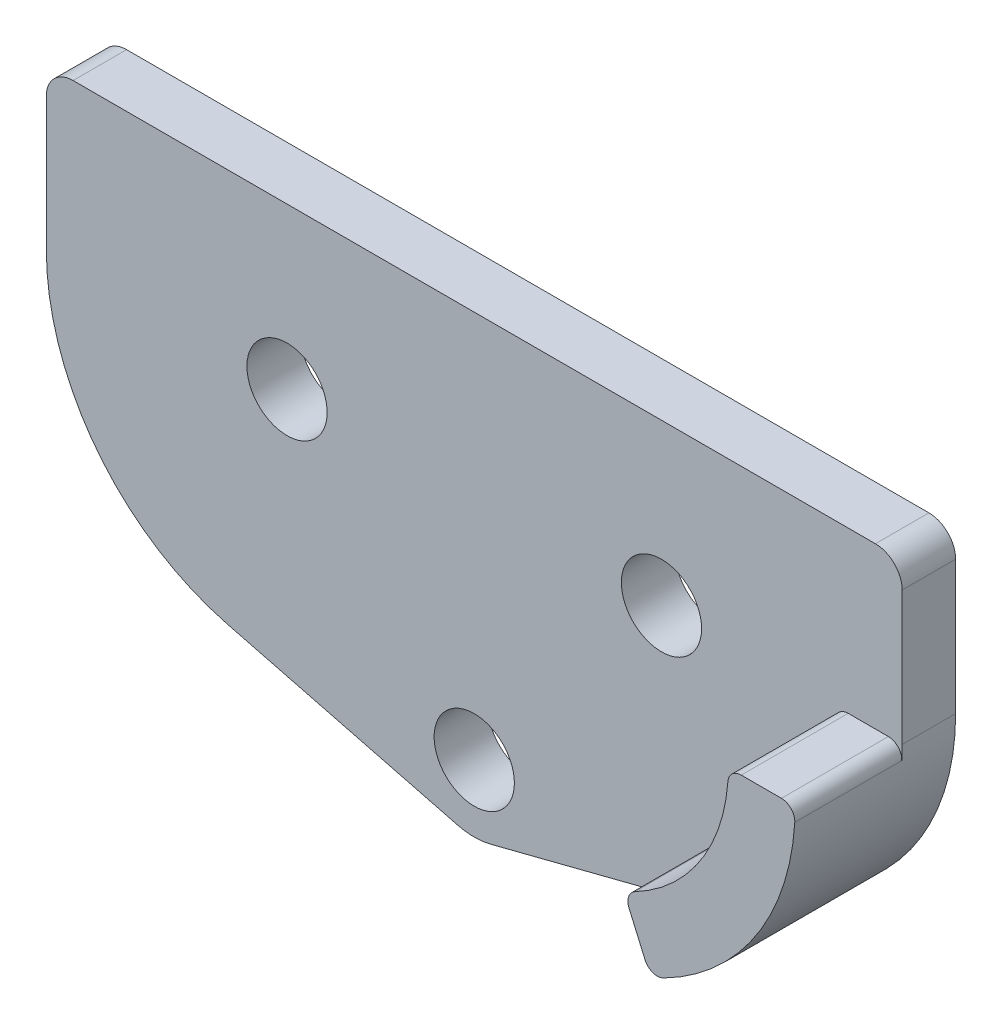
ISO-10303-21;
HEADER;
FILE_DESCRIPTION(('STEP AP214'),'2;1');
FILE_NAME('part.step','',(''),(''),'','','');
FILE_SCHEMA(('AUTOMOTIVE_DESIGN { 1 0 10303 214 1 1 1 1 }'));
ENDSEC;
DATA;
#1=APPLICATION_CONTEXT('core data for automotive mechanical design processes');
#2=APPLICATION_PROTOCOL_DEFINITION('international standard','automotive_design',2000,#1);
#3=PRODUCT_CONTEXT('',#1,'mechanical');
#4=PRODUCT('Part','Part','',(#3));
#5=PRODUCT_RELATED_PRODUCT_CATEGORY('part','',(#4));
#6=PRODUCT_DEFINITION_FORMATION('','',#4);
#7=PRODUCT_DEFINITION_CONTEXT('part definition',#1,'design');
#8=PRODUCT_DEFINITION('design','',#6,#7);
#9=PRODUCT_DEFINITION_SHAPE('','',#8);
#10=(LENGTH_UNIT() NAMED_UNIT(*) SI_UNIT(.MILLI.,.METRE.));
#11=(NAMED_UNIT(*) PLANE_ANGLE_UNIT() SI_UNIT($,.RADIAN.));
#12=(NAMED_UNIT(*) SI_UNIT($,.STERADIAN.) SOLID_ANGLE_UNIT());
#13=UNCERTAINTY_MEASURE_WITH_UNIT(LENGTH_MEASURE(1.E-05),#10,'distance_accuracy_value','');
#14=(GEOMETRIC_REPRESENTATION_CONTEXT(3) GLOBAL_UNCERTAINTY_ASSIGNED_CONTEXT((#13)) GLOBAL_UNIT_ASSIGNED_CONTEXT((#10,
#11,#12)) REPRESENTATION_CONTEXT('',''));
#15=CARTESIAN_POINT('',(0.,0.,0.));
#16=DIRECTION('',(0.,0.,1.));
#17=DIRECTION('',(1.,0.,0.));
#18=AXIS2_PLACEMENT_3D('',#15,#16,#17);
#19=CARTESIAN_POINT('',(7.,0.,2.));
#20=DIRECTION('',(0.,0.,1.));
#21=DIRECTION('',(1.,0.,0.));
#22=AXIS2_PLACEMENT_3D('',#19,#20,#21);
#23=PLANE('',#22);
#24=DIRECTION('',(-1.,0.,0.));
#25=VECTOR('',#24,1.);
#26=CARTESIAN_POINT('',(16.,6.,2.));
#27=LINE('',#26,#25);
#28=CARTESIAN_POINT('',(15.,6.,2.));
#29=VERTEX_POINT('',#28);
#30=CARTESIAN_POINT('',(-15.,6.,2.));
#31=VERTEX_POINT('',#30);
#32=EDGE_CURVE('E167',#29,#31,#27,.T.);
#33=ORIENTED_EDGE('',*,*,#32,.T.);
#34=CARTESIAN_POINT('',(-15.,5.,2.));
#35=DIRECTION('',(0.,0.,1.));
#36=DIRECTION('',(1.,0.,0.));
#37=AXIS2_PLACEMENT_3D('',#34,#35,#36);
#38=CIRCLE('',#37,1.);
#39=CARTESIAN_POINT('',(-16.,5.,2.));
#40=VERTEX_POINT('',#39);
#41=EDGE_CURVE('E163',#31,#40,#38,.T.);
#42=ORIENTED_EDGE('',*,*,#41,.T.);
#43=DIRECTION('',(0.,-1.,0.));
#44=VECTOR('',#43,1.);
#45=CARTESIAN_POINT('',(-16.,0.,2.));
#46=LINE('',#45,#44);
#47=CARTESIAN_POINT('',(-16.,0.,2.));
#48=VERTEX_POINT('',#47);
#49=EDGE_CURVE('E155',#40,#48,#46,.T.);
#50=ORIENTED_EDGE('',*,*,#49,.T.);
#51=CARTESIAN_POINT('',(-7.,0.,2.));
#52=DIRECTION('',(0.,0.,1.));
#53=DIRECTION('',(-1.,0.,0.));
#54=AXIS2_PLACEMENT_3D('',#51,#52,#53);
#55=CIRCLE('',#54,9.00000000000001);
#56=CARTESIAN_POINT('',(-9.2304896736053,-8.7192267900279,2.));
#57=VERTEX_POINT('',#56);
#58=EDGE_CURVE('E160',#48,#57,#55,.T.);
#59=ORIENTED_EDGE('',*,*,#58,.T.);
#60=DIRECTION('',(0.968802976669766,-0.247832185956144,0.));
#61=VECTOR('',#60,1.);
#62=CARTESIAN_POINT('',(-9.2304896736053,-8.7192267900279,2.));
#63=LINE('',#62,#61);
#64=CARTESIAN_POINT('',(-0.619580464890357,-10.9220074416744,2.));
#65=VERTEX_POINT('',#64);
#66=EDGE_CURVE('E182',#57,#65,#63,.T.);
#67=ORIENTED_EDGE('',*,*,#66,.T.);
#68=CARTESIAN_POINT('',(0.,-8.5,2.));
#69=DIRECTION('',(0.,0.,1.));
#70=DIRECTION('',(-1.,0.,0.));
#71=AXIS2_PLACEMENT_3D('',#68,#69,#70);
#72=CIRCLE('',#71,2.5);
#73=CARTESIAN_POINT('',(0.619580464890362,-10.9220074416744,2.));
#74=VERTEX_POINT('',#73);
#75=EDGE_CURVE('E184',#65,#74,#72,.T.);
#76=ORIENTED_EDGE('',*,*,#75,.T.);
#77=DIRECTION('',(0.968802976669766,0.247832185956144,0.));
#78=VECTOR('',#77,1.);
#79=CARTESIAN_POINT('',(9.2304896736053,-8.7192267900279,2.));
#80=LINE('',#79,#78);
#81=CARTESIAN_POINT('',(9.2304896736053,-8.7192267900279,2.));
#82=VERTEX_POINT('',#81);
#83=EDGE_CURVE('E189',#74,#82,#80,.T.);
#84=ORIENTED_EDGE('',*,*,#83,.T.);
#85=CARTESIAN_POINT('',(7.,0.,2.));
#86=DIRECTION('',(0.,0.,1.));
#87=DIRECTION('',(1.,0.,0.));
#88=AXIS2_PLACEMENT_3D('',#85,#86,#87);
#89=CIRCLE('',#88,9.);
#90=CARTESIAN_POINT('',(11.0711124139553,-8.02658356419088,2.));
#91=VERTEX_POINT('',#90);
#92=EDGE_CURVE('E211',#82,#91,#89,.T.);
#93=ORIENTED_EDGE('',*,*,#92,.T.);
#94=CARTESIAN_POINT('',(10.8449395020689,-7.58066225506916,2.));
#95=DIRECTION('',(0.,0.,1.));
#96=DIRECTION('',(1.,0.,0.));
#97=AXIS2_PLACEMENT_3D('',#94,#95,#96);
#98=CIRCLE('',#97,0.5);
#99=CARTESIAN_POINT('',(10.386486062703,-7.78021286001342,2.));
#100=VERTEX_POINT('',#99);
#101=EDGE_CURVE('E270',#91,#100,#98,.F.);
#102=ORIENTED_EDGE('',*,*,#101,.T.);
#103=DIRECTION('',(0.399101209888507,-0.916906878731712,0.));
#104=VECTOR('',#103,1.);
#105=CARTESIAN_POINT('',(9.5941578642753,-5.95989471175613,2.));
#106=LINE('',#105,#104);
#107=CARTESIAN_POINT('',(9.78657254832086,-6.40195387619628,2.));
#108=VERTEX_POINT('',#107);
#109=EDGE_CURVE('E297',#108,#100,#106,.T.);
#110=ORIENTED_EDGE('',*,*,#109,.F.);
#111=CARTESIAN_POINT('',(10.2450259876867,-6.20240327125203,2.));
#112=DIRECTION('',(0.,0.,1.));
#113=DIRECTION('',(1.,0.,0.));
#114=AXIS2_PLACEMENT_3D('',#111,#112,#113);
#115=CIRCLE('',#114,0.5);
#116=CARTESIAN_POINT('',(10.0132384171377,-5.7593744661626,2.));
#117=VERTEX_POINT('',#116);
#118=EDGE_CURVE('E268',#108,#117,#115,.F.);
#119=ORIENTED_EDGE('',*,*,#118,.T.);
#120=CARTESIAN_POINT('',(7.,0.,2.));
#121=DIRECTION('',(0.,0.,-1.));
#122=DIRECTION('',(1.,0.,0.));
#123=AXIS2_PLACEMENT_3D('',#120,#121,#122);
#124=CIRCLE('',#123,6.5);
#125=CARTESIAN_POINT('',(13.4833971631784,-0.464285714285714,2.));
#126=VERTEX_POINT('',#125);
#127=EDGE_CURVE('E304',#126,#117,#124,.T.);
#128=ORIENTED_EDGE('',*,*,#127,.F.);
#129=CARTESIAN_POINT('',(13.9821200218845,-0.5,2.));
#130=DIRECTION('',(0.,0.,1.));
#131=DIRECTION('',(1.,0.,0.));
#132=AXIS2_PLACEMENT_3D('',#129,#130,#131);
#133=CIRCLE('',#132,0.5);
#134=CARTESIAN_POINT('',(13.9821200218845,0.,2.));
#135=VERTEX_POINT('',#134);
#136=EDGE_CURVE('E11',#126,#135,#133,.F.);
#137=ORIENTED_EDGE('',*,*,#136,.T.);
#138=DIRECTION('',(-1.,0.,0.));
#139=VECTOR('',#138,1.);
#140=CARTESIAN_POINT('',(13.5,0.,2.));
#141=LINE('',#140,#139);
#142=CARTESIAN_POINT('',(15.4852813742386,0.,2.));
#143=VERTEX_POINT('',#142);
#144=EDGE_CURVE('E271',#143,#135,#141,.T.);
#145=ORIENTED_EDGE('',*,*,#144,.F.);
#146=CARTESIAN_POINT('',(15.4852813742386,-0.5,2.));
#147=DIRECTION('',(0.,0.,1.));
#148=DIRECTION('',(1.,0.,0.));
#149=AXIS2_PLACEMENT_3D('',#146,#147,#148);
#150=CIRCLE('',#149,0.5);
#151=CARTESIAN_POINT('',(15.9844155727232,-0.529411764705882,2.));
#152=VERTEX_POINT('',#151);
#153=EDGE_CURVE('E41',#143,#152,#150,.F.);
#154=ORIENTED_EDGE('',*,*,#153,.T.);
#155=CARTESIAN_POINT('',(7.,0.,2.));
#156=DIRECTION('',(0.,0.,1.));
#157=DIRECTION('',(1.,0.,0.));
#158=AXIS2_PLACEMENT_3D('',#155,#156,#157);
#159=CIRCLE('',#158,9.);
#160=CARTESIAN_POINT('',(16.,0.,2.));
#161=VERTEX_POINT('',#160);
#162=EDGE_CURVE('E48',#161,#152,#159,.F.);
#163=ORIENTED_EDGE('',*,*,#162,.F.);
#164=DIRECTION('',(0.,1.,0.));
#165=VECTOR('',#164,1.);
#166=CARTESIAN_POINT('',(16.,0.,2.));
#167=LINE('',#166,#165);
#168=CARTESIAN_POINT('',(16.,5.00000000000001,2.));
#169=VERTEX_POINT('',#168);
#170=EDGE_CURVE('E326',#161,#169,#167,.T.);
#171=ORIENTED_EDGE('',*,*,#170,.T.);
#172=CARTESIAN_POINT('',(15.,5.00000000000001,2.));
#173=DIRECTION('',(0.,0.,1.));
#174=DIRECTION('',(1.,0.,0.));
#175=AXIS2_PLACEMENT_3D('',#172,#173,#174);
#176=CIRCLE('',#175,1.);
#177=EDGE_CURVE('E234',#169,#29,#176,.T.);
#178=ORIENTED_EDGE('',*,*,#177,.T.);
#179=EDGE_LOOP('',(#33,#42,#50,#59,#67,#76,#84,#93,#102,#110,#119,#128,#137,#145,#154,#163,#171,#178));
#180=FACE_BOUND('',#179,.T.);
#181=CARTESIAN_POINT('',(7.,0.,2.));
#182=DIRECTION('',(0.,0.,1.));
#183=DIRECTION('',(1.,0.,0.));
#184=AXIS2_PLACEMENT_3D('',#181,#182,#183);
#185=CIRCLE('',#184,1.5);
#186=CARTESIAN_POINT('',(8.5,0.,2.));
#187=VERTEX_POINT('',#186);
#188=EDGE_CURVE('E315',#187,#187,#185,.T.);
#189=ORIENTED_EDGE('',*,*,#188,.F.);
#190=EDGE_LOOP('',(#189));
#191=FACE_BOUND('',#190,.T.);
#192=CARTESIAN_POINT('',(0.,-8.5,2.));
#193=DIRECTION('',(0.,0.,1.));
#194=DIRECTION('',(1.,0.,0.));
#195=AXIS2_PLACEMENT_3D('',#192,#193,#194);
#196=CIRCLE('',#195,1.5);
#197=CARTESIAN_POINT('',(1.5,-8.5,2.));
#198=VERTEX_POINT('',#197);
#199=EDGE_CURVE('E196',#198,#198,#196,.T.);
#200=ORIENTED_EDGE('',*,*,#199,.F.);
#201=EDGE_LOOP('',(#200));
#202=FACE_BOUND('',#201,.T.);
#203=CARTESIAN_POINT('',(-7.,0.,2.));
#204=DIRECTION('',(0.,0.,1.));
#205=DIRECTION('',(-1.,0.,0.));
#206=AXIS2_PLACEMENT_3D('',#203,#204,#205);
#207=CIRCLE('',#206,1.5);
#208=CARTESIAN_POINT('',(-8.5,0.,2.));
#209=VERTEX_POINT('',#208);
#210=EDGE_CURVE('E309',#209,#209,#207,.T.);
#211=ORIENTED_EDGE('',*,*,#210,.F.);
#212=EDGE_LOOP('',(#211));
#213=FACE_BOUND('',#212,.T.);
#214=ADVANCED_FACE('F33',(#180,#191,#202,#213),#23,.T.);
#215=CARTESIAN_POINT('',(7.,0.,0.));
#216=DIRECTION('',(0.,0.,1.));
#217=DIRECTION('',(1.,0.,0.));
#218=AXIS2_PLACEMENT_3D('',#215,#216,#217);
#219=PLANE('',#218);
#220=DIRECTION('',(0.,-1.,0.));
#221=VECTOR('',#220,1.);
#222=CARTESIAN_POINT('',(-16.,0.,0.));
#223=LINE('',#222,#221);
#224=CARTESIAN_POINT('',(-16.,5.,0.));
#225=VERTEX_POINT('',#224);
#226=CARTESIAN_POINT('',(-16.,0.,0.));
#227=VERTEX_POINT('',#226);
#228=EDGE_CURVE('E173',#225,#227,#223,.T.);
#229=ORIENTED_EDGE('',*,*,#228,.F.);
#230=CARTESIAN_POINT('',(-15.,5.,0.));
#231=DIRECTION('',(0.,0.,1.));
#232=DIRECTION('',(1.,0.,0.));
#233=AXIS2_PLACEMENT_3D('',#230,#231,#232);
#234=CIRCLE('',#233,1.);
#235=CARTESIAN_POINT('',(-15.,6.,0.));
#236=VERTEX_POINT('',#235);
#237=EDGE_CURVE('E227',#225,#236,#234,.F.);
#238=ORIENTED_EDGE('',*,*,#237,.T.);
#239=DIRECTION('',(-1.,0.,0.));
#240=VECTOR('',#239,1.);
#241=CARTESIAN_POINT('',(-16.,6.,0.));
#242=LINE('',#241,#240);
#243=CARTESIAN_POINT('',(15.,6.00000000000001,0.));
#244=VERTEX_POINT('',#243);
#245=EDGE_CURVE('E199',#244,#236,#242,.T.);
#246=ORIENTED_EDGE('',*,*,#245,.F.);
#247=CARTESIAN_POINT('',(15.,5.00000000000001,0.));
#248=DIRECTION('',(0.,0.,1.));
#249=DIRECTION('',(1.,0.,0.));
#250=AXIS2_PLACEMENT_3D('',#247,#248,#249);
#251=CIRCLE('',#250,1.);
#252=CARTESIAN_POINT('',(16.,5.00000000000001,0.));
#253=VERTEX_POINT('',#252);
#254=EDGE_CURVE('E225',#244,#253,#251,.F.);
#255=ORIENTED_EDGE('',*,*,#254,.T.);
#256=DIRECTION('',(0.,1.,0.));
#257=VECTOR('',#256,1.);
#258=CARTESIAN_POINT('',(16.,0.,0.));
#259=LINE('',#258,#257);
#260=CARTESIAN_POINT('',(16.,0.,0.));
#261=VERTEX_POINT('',#260);
#262=EDGE_CURVE('E195',#261,#253,#259,.T.);
#263=ORIENTED_EDGE('',*,*,#262,.F.);
#264=CARTESIAN_POINT('',(7.,0.,0.));
#265=DIRECTION('',(0.,0.,1.));
#266=DIRECTION('',(1.,0.,0.));
#267=AXIS2_PLACEMENT_3D('',#264,#265,#266);
#268=CIRCLE('',#267,9.);
#269=CARTESIAN_POINT('',(9.2304896736053,-8.7192267900279,0.));
#270=VERTEX_POINT('',#269);
#271=EDGE_CURVE('E192',#270,#261,#268,.T.);
#272=ORIENTED_EDGE('',*,*,#271,.F.);
#273=DIRECTION('',(0.968802976669766,0.247832185956144,0.));
#274=VECTOR('',#273,1.);
#275=CARTESIAN_POINT('',(9.2304896736053,-8.7192267900279,0.));
#276=LINE('',#275,#274);
#277=CARTESIAN_POINT('',(0.619580464890362,-10.9220074416744,0.));
#278=VERTEX_POINT('',#277);
#279=EDGE_CURVE('E209',#278,#270,#276,.T.);
#280=ORIENTED_EDGE('',*,*,#279,.F.);
#281=CARTESIAN_POINT('',(0.,-8.5,0.));
#282=DIRECTION('',(0.,0.,1.));
#283=DIRECTION('',(-1.,0.,0.));
#284=AXIS2_PLACEMENT_3D('',#281,#282,#283);
#285=CIRCLE('',#284,2.5);
#286=CARTESIAN_POINT('',(-0.619580464890357,-10.9220074416744,0.));
#287=VERTEX_POINT('',#286);
#288=EDGE_CURVE('E207',#287,#278,#285,.T.);
#289=ORIENTED_EDGE('',*,*,#288,.F.);
#290=DIRECTION('',(0.968802976669766,-0.247832185956144,0.));
#291=VECTOR('',#290,1.);
#292=CARTESIAN_POINT('',(-9.2304896736053,-8.7192267900279,0.));
#293=LINE('',#292,#291);
#294=CARTESIAN_POINT('',(-9.2304896736053,-8.7192267900279,0.));
#295=VERTEX_POINT('',#294);
#296=EDGE_CURVE('E205',#295,#287,#293,.T.);
#297=ORIENTED_EDGE('',*,*,#296,.F.);
#298=CARTESIAN_POINT('',(-7.,0.,0.));
#299=DIRECTION('',(0.,0.,1.));
#300=DIRECTION('',(-1.,0.,0.));
#301=AXIS2_PLACEMENT_3D('',#298,#299,#300);
#302=CIRCLE('',#301,9.00000000000001);
#303=EDGE_CURVE('E203',#227,#295,#302,.T.);
#304=ORIENTED_EDGE('',*,*,#303,.F.);
#305=EDGE_LOOP('',(#229,#238,#246,#255,#263,#272,#280,#289,#297,#304));
#306=FACE_BOUND('',#305,.T.);
#307=CARTESIAN_POINT('',(0.,-8.5,0.));
#308=DIRECTION('',(0.,0.,1.));
#309=DIRECTION('',(1.,0.,0.));
#310=AXIS2_PLACEMENT_3D('',#307,#308,#309);
#311=CIRCLE('',#310,1.5);
#312=CARTESIAN_POINT('',(1.5,-8.5,0.));
#313=VERTEX_POINT('',#312);
#314=EDGE_CURVE('E318',#313,#313,#311,.T.);
#315=ORIENTED_EDGE('',*,*,#314,.T.);
#316=EDGE_LOOP('',(#315));
#317=FACE_BOUND('',#316,.T.);
#318=CARTESIAN_POINT('',(7.,0.,0.));
#319=DIRECTION('',(0.,0.,1.));
#320=DIRECTION('',(1.,0.,0.));
#321=AXIS2_PLACEMENT_3D('',#318,#319,#320);
#322=CIRCLE('',#321,1.5);
#323=CARTESIAN_POINT('',(8.5,0.,0.));
#324=VERTEX_POINT('',#323);
#325=EDGE_CURVE('E312',#324,#324,#322,.T.);
#326=ORIENTED_EDGE('',*,*,#325,.T.);
#327=EDGE_LOOP('',(#326));
#328=FACE_BOUND('',#327,.T.);
#329=CARTESIAN_POINT('',(-7.,0.,0.));
#330=DIRECTION('',(0.,0.,1.));
#331=DIRECTION('',(-1.,0.,0.));
#332=AXIS2_PLACEMENT_3D('',#329,#330,#331);
#333=CIRCLE('',#332,1.5);
#334=CARTESIAN_POINT('',(-8.5,0.,0.));
#335=VERTEX_POINT('',#334);
#336=EDGE_CURVE('E302',#335,#335,#333,.T.);
#337=ORIENTED_EDGE('',*,*,#336,.T.);
#338=EDGE_LOOP('',(#337));
#339=FACE_BOUND('',#338,.T.);
#340=ADVANCED_FACE('F335',(#306,#317,#328,#339),#219,.F.);
#341=CARTESIAN_POINT('',(7.,0.,2.));
#342=DIRECTION('',(0.,0.,-1.));
#343=DIRECTION('',(-1.,0.,0.));
#344=AXIS2_PLACEMENT_3D('',#341,#342,#343);
#345=CYLINDRICAL_SURFACE('',#344,9.);
#346=CARTESIAN_POINT('',(7.,0.,6.));
#347=DIRECTION('',(0.,0.,1.));
#348=DIRECTION('',(1.,0.,0.));
#349=AXIS2_PLACEMENT_3D('',#346,#347,#348);
#350=CIRCLE('',#349,9.00000000000001);
#351=CARTESIAN_POINT('',(11.0711124139553,-8.02658356419088,6.));
#352=VERTEX_POINT('',#351);
#353=CARTESIAN_POINT('',(15.9844155727232,-0.529411764705882,6.));
#354=VERTEX_POINT('',#353);
#355=EDGE_CURVE('E289',#352,#354,#350,.T.);
#356=ORIENTED_EDGE('',*,*,#355,.F.);
#357=DIRECTION('',(0.,0.,-1.));
#358=VECTOR('',#357,1.);
#359=CARTESIAN_POINT('',(11.0711124139553,-8.02658356419088,2.));
#360=LINE('',#359,#358);
#361=EDGE_CURVE('E260',#352,#91,#360,.T.);
#362=ORIENTED_EDGE('',*,*,#361,.T.);
#363=ORIENTED_EDGE('',*,*,#92,.F.);
#364=DIRECTION('',(0.,0.,-1.));
#365=VECTOR('',#364,1.);
#366=CARTESIAN_POINT('',(9.2304896736053,-8.7192267900279,2.));
#367=LINE('',#366,#365);
#368=EDGE_CURVE('E191',#82,#270,#367,.T.);
#369=ORIENTED_EDGE('',*,*,#368,.T.);
#370=ORIENTED_EDGE('',*,*,#271,.T.);
#371=DIRECTION('',(0.,0.,-1.));
#372=VECTOR('',#371,1.);
#373=CARTESIAN_POINT('',(16.,0.,2.));
#374=LINE('',#373,#372);
#375=EDGE_CURVE('E176',#161,#261,#374,.T.);
#376=ORIENTED_EDGE('',*,*,#375,.F.);
#377=ORIENTED_EDGE('',*,*,#162,.T.);
#378=DIRECTION('',(0.,0.,-1.));
#379=VECTOR('',#378,1.);
#380=CARTESIAN_POINT('',(15.9844155727232,-0.529411764705882,2.));
#381=LINE('',#380,#379);
#382=EDGE_CURVE('E257',#152,#354,#381,.F.);
#383=ORIENTED_EDGE('',*,*,#382,.T.);
#384=EDGE_LOOP('',(#356,#362,#363,#369,#370,#376,#377,#383));
#385=FACE_BOUND('',#384,.T.);
#386=ADVANCED_FACE('F277',(#385),#345,.T.);
#387=CARTESIAN_POINT('',(16.,0.,2.));
#388=DIRECTION('',(-1.,0.,0.));
#389=DIRECTION('',(0.,0.,1.));
#390=AXIS2_PLACEMENT_3D('',#387,#388,#389);
#391=PLANE('',#390);
#392=ORIENTED_EDGE('',*,*,#262,.T.);
#393=DIRECTION('',(0.,0.,-1.));
#394=VECTOR('',#393,1.);
#395=CARTESIAN_POINT('',(16.,5.00000000000001,2.));
#396=LINE('',#395,#394);
#397=EDGE_CURVE('E237',#253,#169,#396,.F.);
#398=ORIENTED_EDGE('',*,*,#397,.T.);
#399=ORIENTED_EDGE('',*,*,#170,.F.);
#400=ORIENTED_EDGE('',*,*,#375,.T.);
#401=EDGE_LOOP('',(#392,#398,#399,#400));
#402=FACE_BOUND('',#401,.T.);
#403=ADVANCED_FACE('F401',(#402),#391,.F.);
#404=CARTESIAN_POINT('',(-16.,6.,2.));
#405=DIRECTION('',(0.,-1.,0.));
#406=DIRECTION('',(1.,0.,0.));
#407=AXIS2_PLACEMENT_3D('',#404,#405,#406);
#408=PLANE('',#407);
#409=ORIENTED_EDGE('',*,*,#245,.T.);
#410=DIRECTION('',(0.,0.,-1.));
#411=VECTOR('',#410,1.);
#412=CARTESIAN_POINT('',(-15.,6.,2.));
#413=LINE('',#412,#411);
#414=EDGE_CURVE('E232',#236,#31,#413,.F.);
#415=ORIENTED_EDGE('',*,*,#414,.T.);
#416=ORIENTED_EDGE('',*,*,#32,.F.);
#417=DIRECTION('',(0.,0.,-1.));
#418=VECTOR('',#417,1.);
#419=CARTESIAN_POINT('',(15.,6.00000000000001,2.));
#420=LINE('',#419,#418);
#421=EDGE_CURVE('E229',#29,#244,#420,.T.);
#422=ORIENTED_EDGE('',*,*,#421,.T.);
#423=EDGE_LOOP('',(#409,#415,#416,#422));
#424=FACE_BOUND('',#423,.T.);
#425=ADVANCED_FACE('F398',(#424),#408,.F.);
#426=CARTESIAN_POINT('',(-16.,0.,2.));
#427=DIRECTION('',(1.,0.,0.));
#428=DIRECTION('',(0.,0.,-1.));
#429=AXIS2_PLACEMENT_3D('',#426,#427,#428);
#430=PLANE('',#429);
#431=ORIENTED_EDGE('',*,*,#49,.F.);
#432=DIRECTION('',(0.,0.,-1.));
#433=VECTOR('',#432,1.);
#434=CARTESIAN_POINT('',(-16.,5.,2.));
#435=LINE('',#434,#433);
#436=EDGE_CURVE('E223',#40,#225,#435,.T.);
#437=ORIENTED_EDGE('',*,*,#436,.T.);
#438=ORIENTED_EDGE('',*,*,#228,.T.);
#439=DIRECTION('',(0.,0.,-1.));
#440=VECTOR('',#439,1.);
#441=CARTESIAN_POINT('',(-16.,0.,2.));
#442=LINE('',#441,#440);
#443=EDGE_CURVE('E170',#48,#227,#442,.T.);
#444=ORIENTED_EDGE('',*,*,#443,.F.);
#445=EDGE_LOOP('',(#431,#437,#438,#444));
#446=FACE_BOUND('',#445,.T.);
#447=ADVANCED_FACE('F171',(#446),#430,.F.);
#448=CARTESIAN_POINT('',(-7.,0.,2.));
#449=DIRECTION('',(0.,0.,-1.));
#450=DIRECTION('',(-1.,0.,0.));
#451=AXIS2_PLACEMENT_3D('',#448,#449,#450);
#452=CYLINDRICAL_SURFACE('',#451,9.00000000000001);
#453=ORIENTED_EDGE('',*,*,#303,.T.);
#454=DIRECTION('',(0.,0.,-1.));
#455=VECTOR('',#454,1.);
#456=CARTESIAN_POINT('',(-9.2304896736053,-8.7192267900279,2.));
#457=LINE('',#456,#455);
#458=EDGE_CURVE('E177',#57,#295,#457,.T.);
#459=ORIENTED_EDGE('',*,*,#458,.F.);
#460=ORIENTED_EDGE('',*,*,#58,.F.);
#461=ORIENTED_EDGE('',*,*,#443,.T.);
#462=EDGE_LOOP('',(#453,#459,#460,#461));
#463=FACE_BOUND('',#462,.T.);
#464=ADVANCED_FACE('F179',(#463),#452,.T.);
#465=CARTESIAN_POINT('',(-9.2304896736053,-8.7192267900279,2.));
#466=DIRECTION('',(0.247832185956144,0.968802976669766,0.));
#467=DIRECTION('',(-0.968802976669766,0.247832185956144,0.));
#468=AXIS2_PLACEMENT_3D('',#465,#466,#467);
#469=PLANE('',#468);
#470=ORIENTED_EDGE('',*,*,#296,.T.);
#471=DIRECTION('',(0.,0.,-1.));
#472=VECTOR('',#471,1.);
#473=CARTESIAN_POINT('',(-0.619580464890357,-10.9220074416744,2.));
#474=LINE('',#473,#472);
#475=EDGE_CURVE('E217',#65,#287,#474,.T.);
#476=ORIENTED_EDGE('',*,*,#475,.F.);
#477=ORIENTED_EDGE('',*,*,#66,.F.);
#478=ORIENTED_EDGE('',*,*,#458,.T.);
#479=EDGE_LOOP('',(#470,#476,#477,#478));
#480=FACE_BOUND('',#479,.T.);
#481=ADVANCED_FACE('F341',(#480),#469,.F.);
#482=CARTESIAN_POINT('',(0.,-8.5,2.));
#483=DIRECTION('',(0.,0.,-1.));
#484=DIRECTION('',(-1.,0.,0.));
#485=AXIS2_PLACEMENT_3D('',#482,#483,#484);
#486=CYLINDRICAL_SURFACE('',#485,2.5);
#487=ORIENTED_EDGE('',*,*,#288,.T.);
#488=DIRECTION('',(0.,0.,-1.));
#489=VECTOR('',#488,1.);
#490=CARTESIAN_POINT('',(0.619580464890362,-10.9220074416744,2.));
#491=LINE('',#490,#489);
#492=EDGE_CURVE('E214',#74,#278,#491,.T.);
#493=ORIENTED_EDGE('',*,*,#492,.F.);
#494=ORIENTED_EDGE('',*,*,#75,.F.);
#495=ORIENTED_EDGE('',*,*,#475,.T.);
#496=EDGE_LOOP('',(#487,#493,#494,#495));
#497=FACE_BOUND('',#496,.T.);
#498=ADVANCED_FACE('F348',(#497),#486,.T.);
#499=CARTESIAN_POINT('',(9.2304896736053,-8.7192267900279,2.));
#500=DIRECTION('',(-0.247832185956144,0.968802976669766,0.));
#501=DIRECTION('',(-0.968802976669766,-0.247832185956144,0.));
#502=AXIS2_PLACEMENT_3D('',#499,#500,#501);
#503=PLANE('',#502);
#504=ORIENTED_EDGE('',*,*,#279,.T.);
#505=ORIENTED_EDGE('',*,*,#368,.F.);
#506=ORIENTED_EDGE('',*,*,#83,.F.);
#507=ORIENTED_EDGE('',*,*,#492,.T.);
#508=EDGE_LOOP('',(#504,#505,#506,#507));
#509=FACE_BOUND('',#508,.T.);
#510=ADVANCED_FACE('F351',(#509),#503,.F.);
#511=CARTESIAN_POINT('',(0.,-8.5,2.));
#512=DIRECTION('',(0.,0.,-1.));
#513=DIRECTION('',(-1.,0.,0.));
#514=AXIS2_PLACEMENT_3D('',#511,#512,#513);
#515=CYLINDRICAL_SURFACE('',#514,1.5);
#516=ORIENTED_EDGE('',*,*,#199,.T.);
#517=EDGE_LOOP('',(#516));
#518=FACE_BOUND('',#517,.T.);
#519=ORIENTED_EDGE('',*,*,#314,.F.);
#520=EDGE_LOOP('',(#519));
#521=FACE_BOUND('',#520,.T.);
#522=ADVANCED_FACE('F385',(#518,#521),#515,.F.);
#523=CARTESIAN_POINT('',(7.,0.,2.));
#524=DIRECTION('',(0.,0.,-1.));
#525=DIRECTION('',(-1.,0.,0.));
#526=AXIS2_PLACEMENT_3D('',#523,#524,#525);
#527=CYLINDRICAL_SURFACE('',#526,1.5);
#528=ORIENTED_EDGE('',*,*,#188,.T.);
#529=EDGE_LOOP('',(#528));
#530=FACE_BOUND('',#529,.T.);
#531=ORIENTED_EDGE('',*,*,#325,.F.);
#532=EDGE_LOOP('',(#531));
#533=FACE_BOUND('',#532,.T.);
#534=ADVANCED_FACE('F494',(#530,#533),#527,.F.);
#535=CARTESIAN_POINT('',(-7.,0.,2.));
#536=DIRECTION('',(0.,0.,-1.));
#537=DIRECTION('',(-1.,0.,0.));
#538=AXIS2_PLACEMENT_3D('',#535,#536,#537);
#539=CYLINDRICAL_SURFACE('',#538,1.5);
#540=ORIENTED_EDGE('',*,*,#210,.T.);
#541=EDGE_LOOP('',(#540));
#542=FACE_BOUND('',#541,.T.);
#543=ORIENTED_EDGE('',*,*,#336,.F.);
#544=EDGE_LOOP('',(#543));
#545=FACE_BOUND('',#544,.T.);
#546=ADVANCED_FACE('F476',(#542,#545),#539,.F.);
#547=CARTESIAN_POINT('',(13.5,0.,6.));
#548=DIRECTION('',(0.,-1.,0.));
#549=DIRECTION('',(0.,0.,-1.));
#550=AXIS2_PLACEMENT_3D('',#547,#548,#549);
#551=PLANE('',#550);
#552=DIRECTION('',(-1.,0.,0.));
#553=VECTOR('',#552,1.);
#554=CARTESIAN_POINT('',(13.5,0.,6.));
#555=LINE('',#554,#553);
#556=CARTESIAN_POINT('',(15.4852813742386,0.,6.));
#557=VERTEX_POINT('',#556);
#558=CARTESIAN_POINT('',(13.9821200218845,0.,6.));
#559=VERTEX_POINT('',#558);
#560=EDGE_CURVE('E287',#557,#559,#555,.T.);
#561=ORIENTED_EDGE('',*,*,#560,.F.);
#562=DIRECTION('',(0.,0.,-1.));
#563=VECTOR('',#562,1.);
#564=CARTESIAN_POINT('',(15.4852813742386,0.,6.));
#565=LINE('',#564,#563);
#566=EDGE_CURVE('E265',#557,#143,#565,.T.);
#567=ORIENTED_EDGE('',*,*,#566,.T.);
#568=ORIENTED_EDGE('',*,*,#144,.T.);
#569=DIRECTION('',(0.,0.,-1.));
#570=VECTOR('',#569,1.);
#571=CARTESIAN_POINT('',(13.9821200218845,0.,6.));
#572=LINE('',#571,#570);
#573=EDGE_CURVE('E263',#135,#559,#572,.F.);
#574=ORIENTED_EDGE('',*,*,#573,.T.);
#575=EDGE_LOOP('',(#561,#567,#568,#574));
#576=FACE_BOUND('',#575,.T.);
#577=ADVANCED_FACE('F291',(#576),#551,.F.);
#578=CARTESIAN_POINT('',(7.,0.,6.));
#579=DIRECTION('',(0.,0.,-1.));
#580=DIRECTION('',(-1.,0.,0.));
#581=AXIS2_PLACEMENT_3D('',#578,#579,#580);
#582=CYLINDRICAL_SURFACE('',#581,6.5);
#583=ORIENTED_EDGE('',*,*,#127,.T.);
#584=DIRECTION('',(0.,0.,-1.));
#585=VECTOR('',#584,1.);
#586=CARTESIAN_POINT('',(10.0132384171377,-5.7593744661626,6.));
#587=LINE('',#586,#585);
#588=CARTESIAN_POINT('',(10.0132384171377,-5.7593744661626,6.));
#589=VERTEX_POINT('',#588);
#590=EDGE_CURVE('E247',#117,#589,#587,.F.);
#591=ORIENTED_EDGE('',*,*,#590,.T.);
#592=CARTESIAN_POINT('',(7.,0.,6.));
#593=DIRECTION('',(0.,0.,-1.));
#594=DIRECTION('',(1.,0.,0.));
#595=AXIS2_PLACEMENT_3D('',#592,#593,#594);
#596=CIRCLE('',#595,6.5);
#597=CARTESIAN_POINT('',(13.4833971631784,-0.464285714285714,6.));
#598=VERTEX_POINT('',#597);
#599=EDGE_CURVE('E293',#598,#589,#596,.T.);
#600=ORIENTED_EDGE('',*,*,#599,.F.);
#601=DIRECTION('',(0.,0.,-1.));
#602=VECTOR('',#601,1.);
#603=CARTESIAN_POINT('',(13.4833971631784,-0.464285714285715,6.));
#604=LINE('',#603,#602);
#605=EDGE_CURVE('E244',#598,#126,#604,.T.);
#606=ORIENTED_EDGE('',*,*,#605,.T.);
#607=EDGE_LOOP('',(#583,#591,#600,#606));
#608=FACE_BOUND('',#607,.T.);
#609=ADVANCED_FACE('F371',(#608),#582,.F.);
#610=CARTESIAN_POINT('',(9.5941578642753,-5.95989471175613,6.));
#611=DIRECTION('',(0.916906878731712,0.399101209888507,0.));
#612=DIRECTION('',(-0.399101209888507,0.916906878731712,0.));
#613=AXIS2_PLACEMENT_3D('',#610,#611,#612);
#614=PLANE('',#613);
#615=DIRECTION('',(0.399101209888507,-0.916906878731712,0.));
#616=VECTOR('',#615,1.);
#617=CARTESIAN_POINT('',(9.5941578642753,-5.95989471175613,6.));
#618=LINE('',#617,#616);
#619=CARTESIAN_POINT('',(9.78657254832086,-6.40195387619628,6.));
#620=VERTEX_POINT('',#619);
#621=CARTESIAN_POINT('',(10.386486062703,-7.78021286001342,6.));
#622=VERTEX_POINT('',#621);
#623=EDGE_CURVE('E295',#620,#622,#618,.T.);
#624=ORIENTED_EDGE('',*,*,#623,.F.);
#625=DIRECTION('',(0.,0.,-1.));
#626=VECTOR('',#625,1.);
#627=CARTESIAN_POINT('',(9.78657254832086,-6.40195387619628,6.));
#628=LINE('',#627,#626);
#629=EDGE_CURVE('E241',#620,#108,#628,.T.);
#630=ORIENTED_EDGE('',*,*,#629,.T.);
#631=ORIENTED_EDGE('',*,*,#109,.T.);
#632=DIRECTION('',(0.,0.,-1.));
#633=VECTOR('',#632,1.);
#634=CARTESIAN_POINT('',(10.386486062703,-7.78021286001342,6.));
#635=LINE('',#634,#633);
#636=EDGE_CURVE('E239',#100,#622,#635,.F.);
#637=ORIENTED_EDGE('',*,*,#636,.T.);
#638=EDGE_LOOP('',(#624,#630,#631,#637));
#639=FACE_BOUND('',#638,.T.);
#640=ADVANCED_FACE('F363',(#639),#614,.F.);
#641=CARTESIAN_POINT('',(7.,0.,6.));
#642=DIRECTION('',(0.,0.,1.));
#643=DIRECTION('',(1.,0.,0.));
#644=AXIS2_PLACEMENT_3D('',#641,#642,#643);
#645=PLANE('',#644);
#646=ORIENTED_EDGE('',*,*,#599,.T.);
#647=CARTESIAN_POINT('',(10.2450259876867,-6.20240327125203,6.));
#648=DIRECTION('',(0.,0.,1.));
#649=DIRECTION('',(1.,0.,0.));
#650=AXIS2_PLACEMENT_3D('',#647,#648,#649);
#651=CIRCLE('',#650,0.5);
#652=EDGE_CURVE('E255',#589,#620,#651,.T.);
#653=ORIENTED_EDGE('',*,*,#652,.T.);
#654=ORIENTED_EDGE('',*,*,#623,.T.);
#655=CARTESIAN_POINT('',(10.8449395020689,-7.58066225506916,6.));
#656=DIRECTION('',(0.,0.,1.));
#657=DIRECTION('',(1.,0.,0.));
#658=AXIS2_PLACEMENT_3D('',#655,#656,#657);
#659=CIRCLE('',#658,0.5);
#660=EDGE_CURVE('E253',#622,#352,#659,.T.);
#661=ORIENTED_EDGE('',*,*,#660,.T.);
#662=ORIENTED_EDGE('',*,*,#355,.T.);
#663=CARTESIAN_POINT('',(15.4852813742386,-0.5,6.));
#664=DIRECTION('',(0.,0.,1.));
#665=DIRECTION('',(1.,0.,0.));
#666=AXIS2_PLACEMENT_3D('',#663,#664,#665);
#667=CIRCLE('',#666,0.5);
#668=EDGE_CURVE('E251',#354,#557,#667,.T.);
#669=ORIENTED_EDGE('',*,*,#668,.T.);
#670=ORIENTED_EDGE('',*,*,#560,.T.);
#671=CARTESIAN_POINT('',(13.9821200218845,-0.5,6.));
#672=DIRECTION('',(0.,0.,1.));
#673=DIRECTION('',(1.,0.,0.));
#674=AXIS2_PLACEMENT_3D('',#671,#672,#673);
#675=CIRCLE('',#674,0.5);
#676=EDGE_CURVE('E249',#559,#598,#675,.T.);
#677=ORIENTED_EDGE('',*,*,#676,.T.);
#678=EDGE_LOOP('',(#646,#653,#654,#661,#662,#669,#670,#677));
#679=FACE_BOUND('',#678,.T.);
#680=ADVANCED_FACE('F286',(#679),#645,.T.);
#681=CARTESIAN_POINT('',(-15.,5.,2.));
#682=DIRECTION('',(0.,0.,-1.));
#683=DIRECTION('',(-1.,0.,0.));
#684=AXIS2_PLACEMENT_3D('',#681,#682,#683);
#685=CYLINDRICAL_SURFACE('',#684,1.);
#686=ORIENTED_EDGE('',*,*,#41,.F.);
#687=ORIENTED_EDGE('',*,*,#414,.F.);
#688=ORIENTED_EDGE('',*,*,#237,.F.);
#689=ORIENTED_EDGE('',*,*,#436,.F.);
#690=EDGE_LOOP('',(#686,#687,#688,#689));
#691=FACE_BOUND('',#690,.T.);
#692=ADVANCED_FACE('F333',(#691),#685,.T.);
#693=CARTESIAN_POINT('',(15.,5.00000000000001,2.));
#694=DIRECTION('',(0.,0.,-1.));
#695=DIRECTION('',(-1.,0.,0.));
#696=AXIS2_PLACEMENT_3D('',#693,#694,#695);
#697=CYLINDRICAL_SURFACE('',#696,1.);
#698=ORIENTED_EDGE('',*,*,#177,.F.);
#699=ORIENTED_EDGE('',*,*,#397,.F.);
#700=ORIENTED_EDGE('',*,*,#254,.F.);
#701=ORIENTED_EDGE('',*,*,#421,.F.);
#702=EDGE_LOOP('',(#698,#699,#700,#701));
#703=FACE_BOUND('',#702,.T.);
#704=ADVANCED_FACE('F409',(#703),#697,.T.);
#705=CARTESIAN_POINT('',(10.2450259876867,-6.20240327125203,6.));
#706=DIRECTION('',(0.,0.,-1.));
#707=DIRECTION('',(-1.,0.,0.));
#708=AXIS2_PLACEMENT_3D('',#705,#706,#707);
#709=CYLINDRICAL_SURFACE('',#708,0.5);
#710=ORIENTED_EDGE('',*,*,#652,.F.);
#711=ORIENTED_EDGE('',*,*,#590,.F.);
#712=ORIENTED_EDGE('',*,*,#118,.F.);
#713=ORIENTED_EDGE('',*,*,#629,.F.);
#714=EDGE_LOOP('',(#710,#711,#712,#713));
#715=FACE_BOUND('',#714,.T.);
#716=ADVANCED_FACE('F369',(#715),#709,.T.);
#717=CARTESIAN_POINT('',(10.8449395020689,-7.58066225506916,2.));
#718=DIRECTION('',(0.,0.,-1.));
#719=DIRECTION('',(-1.,0.,0.));
#720=AXIS2_PLACEMENT_3D('',#717,#718,#719);
#721=CYLINDRICAL_SURFACE('',#720,0.5);
#722=ORIENTED_EDGE('',*,*,#660,.F.);
#723=ORIENTED_EDGE('',*,*,#636,.F.);
#724=ORIENTED_EDGE('',*,*,#101,.F.);
#725=ORIENTED_EDGE('',*,*,#361,.F.);
#726=EDGE_LOOP('',(#722,#723,#724,#725));
#727=FACE_BOUND('',#726,.T.);
#728=ADVANCED_FACE('F360',(#727),#721,.T.);
#729=CARTESIAN_POINT('',(15.4852813742386,-0.5,2.));
#730=DIRECTION('',(0.,0.,-1.));
#731=DIRECTION('',(-1.,0.,0.));
#732=AXIS2_PLACEMENT_3D('',#729,#730,#731);
#733=CYLINDRICAL_SURFACE('',#732,0.5);
#734=ORIENTED_EDGE('',*,*,#668,.F.);
#735=ORIENTED_EDGE('',*,*,#382,.F.);
#736=ORIENTED_EDGE('',*,*,#153,.F.);
#737=ORIENTED_EDGE('',*,*,#566,.F.);
#738=EDGE_LOOP('',(#734,#735,#736,#737));
#739=FACE_BOUND('',#738,.T.);
#740=ADVANCED_FACE('F281',(#739),#733,.T.);
#741=CARTESIAN_POINT('',(13.9821200218845,-0.5,6.));
#742=DIRECTION('',(0.,0.,-1.));
#743=DIRECTION('',(-1.,0.,0.));
#744=AXIS2_PLACEMENT_3D('',#741,#742,#743);
#745=CYLINDRICAL_SURFACE('',#744,0.5);
#746=ORIENTED_EDGE('',*,*,#676,.F.);
#747=ORIENTED_EDGE('',*,*,#573,.F.);
#748=ORIENTED_EDGE('',*,*,#136,.F.);
#749=ORIENTED_EDGE('',*,*,#605,.F.);
#750=EDGE_LOOP('',(#746,#747,#748,#749));
#751=FACE_BOUND('',#750,.T.);
#752=ADVANCED_FACE('F35',(#751),#745,.T.);
#753=CLOSED_SHELL('',(#214,#340,#386,#403,#425,#447,#464,#481,#498,#510,#522,#534,#546,#577,
#609,#640,#680,#692,#704,#716,#728,#740,#752));
#754=MANIFOLD_SOLID_BREP('B2',#753);
#755=ADVANCED_BREP_SHAPE_REPRESENTATION('',(#18,#754),#14);
#756=SHAPE_DEFINITION_REPRESENTATION(#9,#755);
ENDSEC;
END-ISO-10303-21;
